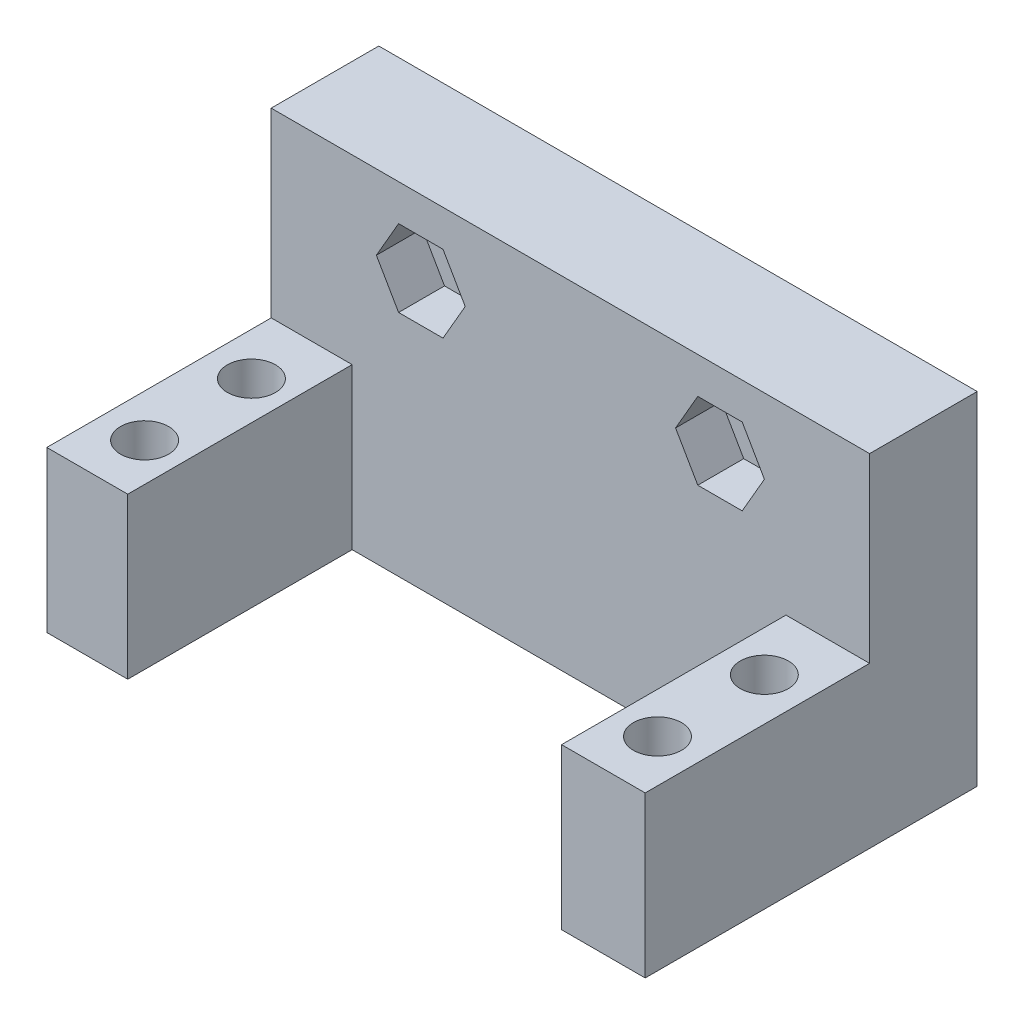
ISO-10303-21;
HEADER;
FILE_DESCRIPTION(('STEP AP214'),'2;1');
FILE_NAME('part.step','',(''),(''),'','','');
FILE_SCHEMA(('AUTOMOTIVE_DESIGN { 1 0 10303 214 1 1 1 1 }'));
ENDSEC;
DATA;
#1=APPLICATION_CONTEXT('core data for automotive mechanical design processes');
#2=APPLICATION_PROTOCOL_DEFINITION('international standard','automotive_design',2000,#1);
#3=PRODUCT_CONTEXT('',#1,'mechanical');
#4=PRODUCT('Part','Part','',(#3));
#5=PRODUCT_RELATED_PRODUCT_CATEGORY('part','',(#4));
#6=PRODUCT_DEFINITION_FORMATION('','',#4);
#7=PRODUCT_DEFINITION_CONTEXT('part definition',#1,'design');
#8=PRODUCT_DEFINITION('design','',#6,#7);
#9=PRODUCT_DEFINITION_SHAPE('','',#8);
#10=(LENGTH_UNIT() NAMED_UNIT(*) SI_UNIT(.MILLI.,.METRE.));
#11=(NAMED_UNIT(*) PLANE_ANGLE_UNIT() SI_UNIT($,.RADIAN.));
#12=(NAMED_UNIT(*) SI_UNIT($,.STERADIAN.) SOLID_ANGLE_UNIT());
#13=UNCERTAINTY_MEASURE_WITH_UNIT(LENGTH_MEASURE(1.E-05),#10,'distance_accuracy_value','');
#14=(GEOMETRIC_REPRESENTATION_CONTEXT(3) GLOBAL_UNCERTAINTY_ASSIGNED_CONTEXT((#13)) GLOBAL_UNIT_ASSIGNED_CONTEXT((#10,
#11,#12)) REPRESENTATION_CONTEXT('',''));
#15=CARTESIAN_POINT('',(0.,0.,0.));
#16=DIRECTION('',(0.,0.,1.));
#17=DIRECTION('',(1.,0.,0.));
#18=AXIS2_PLACEMENT_3D('',#15,#16,#17);
#19=CARTESIAN_POINT('',(0.,-14.,10.07));
#20=DIRECTION('',(0.,0.,1.));
#21=DIRECTION('',(1.,0.,0.));
#22=AXIS2_PLACEMENT_3D('',#19,#20,#21);
#23=PLANE('',#22);
#24=DIRECTION('',(-0.500000000000005,0.866025403784436,0.));
#25=VECTOR('',#24,1.);
#26=CARTESIAN_POINT('',(-1.32013071988487,-14.762177826491,10.07));
#27=LINE('',#26,#25);
#28=CARTESIAN_POINT('',(-9.84307806183471,0.,10.07));
#29=VERTEX_POINT('',#28);
#30=CARTESIAN_POINT('',(-11.9215390309174,3.6,10.07));
#31=VERTEX_POINT('',#30);
#32=EDGE_CURVE('E11',#29,#31,#27,.T.);
#33=ORIENTED_EDGE('',*,*,#32,.F.);
#34=DIRECTION('',(0.499999999999996,0.866025403784441,0.));
#35=VECTOR('',#34,1.);
#36=CARTESIAN_POINT('',(-13.4444863728671,-6.23782217350901,10.07));
#37=LINE('',#36,#35);
#38=CARTESIAN_POINT('',(-11.9215390309173,-3.59999999999998,10.07));
#39=VERTEX_POINT('',#38);
#40=EDGE_CURVE('E48',#39,#29,#37,.T.);
#41=ORIENTED_EDGE('',*,*,#40,.F.);
#42=DIRECTION('',(1.,0.,0.));
#43=VECTOR('',#42,1.);
#44=CARTESIAN_POINT('',(0.,-3.59999999999992,10.07));
#45=LINE('',#44,#43);
#46=CARTESIAN_POINT('',(-16.0784609690826,-3.60000000000001,10.07));
#47=VERTEX_POINT('',#46);
#48=EDGE_CURVE('E395',#47,#39,#45,.T.);
#49=ORIENTED_EDGE('',*,*,#48,.F.);
#50=DIRECTION('',(0.500000000000005,-0.866025403784436,0.));
#51=VECTOR('',#50,1.);
#52=CARTESIAN_POINT('',(-7.55551362713279,-18.3621778264911,10.07));
#53=LINE('',#52,#51);
#54=CARTESIAN_POINT('',(-18.1569219381653,0.,10.07));
#55=VERTEX_POINT('',#54);
#56=EDGE_CURVE('E393',#55,#47,#53,.T.);
#57=ORIENTED_EDGE('',*,*,#56,.F.);
#58=DIRECTION('',(-0.5,-0.866025403784439,0.));
#59=VECTOR('',#58,1.);
#60=CARTESIAN_POINT('',(-19.679869280115,-2.63782217350893,10.07));
#61=LINE('',#60,#59);
#62=CARTESIAN_POINT('',(-16.0784609690827,3.6,10.07));
#63=VERTEX_POINT('',#62);
#64=EDGE_CURVE('E391',#63,#55,#61,.T.);
#65=ORIENTED_EDGE('',*,*,#64,.F.);
#66=DIRECTION('',(-1.,0.,0.));
#67=VECTOR('',#66,1.);
#68=CARTESIAN_POINT('',(0.,3.6,10.07));
#69=LINE('',#68,#67);
#70=EDGE_CURVE('E389',#31,#63,#69,.T.);
#71=ORIENTED_EDGE('',*,*,#70,.F.);
#72=EDGE_LOOP('',(#33,#41,#49,#57,#65,#71));
#73=FACE_BOUND('',#72,.T.);
#74=DIRECTION('',(-0.500000000000004,0.866025403784436,0.));
#75=VECTOR('',#74,1.);
#76=CARTESIAN_POINT('',(19.679869280115,-2.63782217350883,10.07));
#77=LINE('',#76,#75);
#78=CARTESIAN_POINT('',(18.1569219381653,0.,10.07));
#79=VERTEX_POINT('',#78);
#80=CARTESIAN_POINT('',(16.0784609690826,3.59999999999999,10.07));
#81=VERTEX_POINT('',#80);
#82=EDGE_CURVE('E386',#79,#81,#77,.T.);
#83=ORIENTED_EDGE('',*,*,#82,.F.);
#84=DIRECTION('',(0.499999999999995,0.866025403784441,0.));
#85=VECTOR('',#84,1.);
#86=CARTESIAN_POINT('',(7.55551362713301,-18.3621778264911,10.07));
#87=LINE('',#86,#85);
#88=CARTESIAN_POINT('',(16.0784609690827,-3.59999999999998,10.07));
#89=VERTEX_POINT('',#88);
#90=EDGE_CURVE('E384',#89,#79,#87,.T.);
#91=ORIENTED_EDGE('',*,*,#90,.F.);
#92=DIRECTION('',(1.,0.,0.));
#93=VECTOR('',#92,1.);
#94=CARTESIAN_POINT('',(0.,-3.60000000000005,10.07));
#95=LINE('',#94,#93);
#96=CARTESIAN_POINT('',(11.9215390309174,-3.6,10.07));
#97=VERTEX_POINT('',#96);
#98=EDGE_CURVE('E382',#97,#89,#95,.T.);
#99=ORIENTED_EDGE('',*,*,#98,.F.);
#100=DIRECTION('',(0.500000000000004,-0.866025403784436,0.));
#101=VECTOR('',#100,1.);
#102=CARTESIAN_POINT('',(13.4444863728671,-6.23782217350885,10.07));
#103=LINE('',#102,#101);
#104=CARTESIAN_POINT('',(9.84307806183472,0.,10.07));
#105=VERTEX_POINT('',#104);
#106=EDGE_CURVE('E380',#105,#97,#103,.T.);
#107=ORIENTED_EDGE('',*,*,#106,.F.);
#108=DIRECTION('',(-0.499999999999996,-0.866025403784441,0.));
#109=VECTOR('',#108,1.);
#110=CARTESIAN_POINT('',(1.32013071988505,-14.7621778264911,10.07));
#111=LINE('',#110,#109);
#112=CARTESIAN_POINT('',(11.9215390309173,3.59999999999997,10.07));
#113=VERTEX_POINT('',#112);
#114=EDGE_CURVE('E378',#113,#105,#111,.T.);
#115=ORIENTED_EDGE('',*,*,#114,.F.);
#116=DIRECTION('',(-1.,0.,0.));
#117=VECTOR('',#116,1.);
#118=CARTESIAN_POINT('',(0.,3.59999999999992,10.07));
#119=LINE('',#118,#117);
#120=EDGE_CURVE('E376',#81,#113,#119,.T.);
#121=ORIENTED_EDGE('',*,*,#120,.F.);
#122=EDGE_LOOP('',(#83,#91,#99,#107,#115,#121));
#123=FACE_BOUND('',#122,.T.);
#124=DIRECTION('',(0.,-1.,0.));
#125=VECTOR('',#124,1.);
#126=CARTESIAN_POINT('',(20.1750886473847,-9.99999999999999,10.07));
#127=LINE('',#126,#125);
#128=CARTESIAN_POINT('',(20.1750886473847,-9.99999999999999,10.07));
#129=VERTEX_POINT('',#128);
#130=CARTESIAN_POINT('',(20.1750886473847,-25.,10.07));
#131=VERTEX_POINT('',#130);
#132=EDGE_CURVE('E212',#129,#131,#127,.T.);
#133=ORIENTED_EDGE('',*,*,#132,.F.);
#134=DIRECTION('',(-1.,0.,0.));
#135=VECTOR('',#134,1.);
#136=CARTESIAN_POINT('',(28.,-10.,10.07));
#137=LINE('',#136,#135);
#138=CARTESIAN_POINT('',(28.,-10.,10.07));
#139=VERTEX_POINT('',#138);
#140=EDGE_CURVE('E209',#139,#129,#137,.T.);
#141=ORIENTED_EDGE('',*,*,#140,.F.);
#142=DIRECTION('',(0.,1.,0.));
#143=VECTOR('',#142,1.);
#144=CARTESIAN_POINT('',(28.,-10.,10.07));
#145=LINE('',#144,#143);
#146=CARTESIAN_POINT('',(28.,7.,10.07));
#147=VERTEX_POINT('',#146);
#148=EDGE_CURVE('E236',#139,#147,#145,.T.);
#149=ORIENTED_EDGE('',*,*,#148,.T.);
#150=DIRECTION('',(1.,0.,0.));
#151=VECTOR('',#150,1.);
#152=CARTESIAN_POINT('',(0.,7.,10.07));
#153=LINE('',#152,#151);
#154=CARTESIAN_POINT('',(-28.,7.,10.07));
#155=VERTEX_POINT('',#154);
#156=EDGE_CURVE('E358',#155,#147,#153,.T.);
#157=ORIENTED_EDGE('',*,*,#156,.F.);
#158=DIRECTION('',(0.,1.,0.));
#159=VECTOR('',#158,1.);
#160=CARTESIAN_POINT('',(-28.,-10.,10.07));
#161=LINE('',#160,#159);
#162=CARTESIAN_POINT('',(-28.,-10.,10.07));
#163=VERTEX_POINT('',#162);
#164=EDGE_CURVE('E237',#163,#155,#161,.T.);
#165=ORIENTED_EDGE('',*,*,#164,.F.);
#166=CARTESIAN_POINT('',(-20.4249113526153,-10.,10.07));
#167=VERTEX_POINT('',#166);
#168=EDGE_CURVE('E56',#167,#163,#137,.T.);
#169=ORIENTED_EDGE('',*,*,#168,.F.);
#170=DIRECTION('',(0.,1.,0.));
#171=VECTOR('',#170,1.);
#172=CARTESIAN_POINT('',(-20.4249113526153,-25.,10.07));
#173=LINE('',#172,#171);
#174=CARTESIAN_POINT('',(-20.4249113526153,-25.,10.07));
#175=VERTEX_POINT('',#174);
#176=EDGE_CURVE('E227',#175,#167,#173,.T.);
#177=ORIENTED_EDGE('',*,*,#176,.F.);
#178=DIRECTION('',(-1.,0.,0.));
#179=VECTOR('',#178,1.);
#180=CARTESIAN_POINT('',(0.,-25.,10.07));
#181=LINE('',#180,#179);
#182=EDGE_CURVE('E64',#131,#175,#181,.T.);
#183=ORIENTED_EDGE('',*,*,#182,.F.);
#184=EDGE_LOOP('',(#133,#141,#149,#157,#165,#169,#177,#183));
#185=FACE_BOUND('',#184,.T.);
#186=ADVANCED_FACE('F39',(#73,#123,#185),#23,.T.);
#187=CARTESIAN_POINT('',(0.,0.,31.07));
#188=DIRECTION('',(0.,0.,1.));
#189=DIRECTION('',(1.,0.,0.));
#190=AXIS2_PLACEMENT_3D('',#187,#188,#189);
#191=PLANE('',#190);
#192=DIRECTION('',(-1.,0.,0.));
#193=VECTOR('',#192,1.);
#194=CARTESIAN_POINT('',(0.,-25.,31.07));
#195=LINE('',#194,#193);
#196=CARTESIAN_POINT('',(-20.4249113526153,-25.,31.07));
#197=VERTEX_POINT('',#196);
#198=CARTESIAN_POINT('',(-28.,-25.,31.07));
#199=VERTEX_POINT('',#198);
#200=EDGE_CURVE('E338',#197,#199,#195,.T.);
#201=ORIENTED_EDGE('',*,*,#200,.F.);
#202=DIRECTION('',(0.,-1.,0.));
#203=VECTOR('',#202,1.);
#204=CARTESIAN_POINT('',(-20.4249113526153,-25.,31.07));
#205=LINE('',#204,#203);
#206=CARTESIAN_POINT('',(-20.4249113526153,-10.,31.07));
#207=VERTEX_POINT('',#206);
#208=EDGE_CURVE('E221',#207,#197,#205,.T.);
#209=ORIENTED_EDGE('',*,*,#208,.F.);
#210=DIRECTION('',(1.,0.,0.));
#211=VECTOR('',#210,1.);
#212=CARTESIAN_POINT('',(28.,-10.,31.07));
#213=LINE('',#212,#211);
#214=CARTESIAN_POINT('',(-28.,-10.,31.07));
#215=VERTEX_POINT('',#214);
#216=EDGE_CURVE('E202',#215,#207,#213,.T.);
#217=ORIENTED_EDGE('',*,*,#216,.F.);
#218=DIRECTION('',(0.,-1.,0.));
#219=VECTOR('',#218,1.);
#220=CARTESIAN_POINT('',(-28.,-7.,31.07));
#221=LINE('',#220,#219);
#222=EDGE_CURVE('E364',#215,#199,#221,.T.);
#223=ORIENTED_EDGE('',*,*,#222,.T.);
#224=EDGE_LOOP('',(#201,#209,#217,#223));
#225=FACE_BOUND('',#224,.T.);
#226=ADVANCED_FACE('F434',(#225),#191,.T.);
#227=DIRECTION('',(0.,1.,0.));
#228=VECTOR('',#227,1.);
#229=CARTESIAN_POINT('',(28.,-7.,31.07));
#230=LINE('',#229,#228);
#231=CARTESIAN_POINT('',(28.,-25.,31.07));
#232=VERTEX_POINT('',#231);
#233=CARTESIAN_POINT('',(28.,-10.,31.07));
#234=VERTEX_POINT('',#233);
#235=EDGE_CURVE('E198',#232,#234,#230,.T.);
#236=ORIENTED_EDGE('',*,*,#235,.T.);
#237=CARTESIAN_POINT('',(20.1750886473847,-9.99999999999999,31.07));
#238=VERTEX_POINT('',#237);
#239=EDGE_CURVE('E192',#238,#234,#213,.T.);
#240=ORIENTED_EDGE('',*,*,#239,.F.);
#241=DIRECTION('',(0.,1.,0.));
#242=VECTOR('',#241,1.);
#243=CARTESIAN_POINT('',(20.1750886473847,-9.99999999999999,31.07));
#244=LINE('',#243,#242);
#245=CARTESIAN_POINT('',(20.1750886473847,-25.,31.07));
#246=VERTEX_POINT('',#245);
#247=EDGE_CURVE('E197',#246,#238,#244,.T.);
#248=ORIENTED_EDGE('',*,*,#247,.F.);
#249=DIRECTION('',(-1.,0.,0.));
#250=VECTOR('',#249,1.);
#251=CARTESIAN_POINT('',(0.,-25.,31.07));
#252=LINE('',#251,#250);
#253=EDGE_CURVE('E350',#232,#246,#252,.T.);
#254=ORIENTED_EDGE('',*,*,#253,.F.);
#255=EDGE_LOOP('',(#236,#240,#248,#254));
#256=FACE_BOUND('',#255,.T.);
#257=ADVANCED_FACE('F194',(#256),#191,.T.);
#258=CARTESIAN_POINT('',(24.0000000000001,-13.3639610306789,25.92));
#259=DIRECTION('',(0.,1.,0.));
#260=DIRECTION('',(-1.,0.,0.));
#261=AXIS2_PLACEMENT_3D('',#258,#259,#260);
#262=CYLINDRICAL_SURFACE('',#261,2.25);
#263=CARTESIAN_POINT('',(24.0000000000001,-25.,25.92));
#264=DIRECTION('',(0.,-1.,0.));
#265=DIRECTION('',(1.,0.,0.));
#266=AXIS2_PLACEMENT_3D('',#263,#264,#265);
#267=CIRCLE('',#266,2.25);
#268=CARTESIAN_POINT('',(26.2500000000001,-25.,25.92));
#269=VERTEX_POINT('',#268);
#270=EDGE_CURVE('E334',#269,#269,#267,.F.);
#271=ORIENTED_EDGE('',*,*,#270,.F.);
#272=EDGE_LOOP('',(#271));
#273=FACE_BOUND('',#272,.T.);
#274=CARTESIAN_POINT('',(24.0000000000001,-10.,25.92));
#275=DIRECTION('',(0.,1.,0.));
#276=DIRECTION('',(-1.,0.,0.));
#277=AXIS2_PLACEMENT_3D('',#274,#275,#276);
#278=CIRCLE('',#277,2.25);
#279=CARTESIAN_POINT('',(21.7500000000001,-10.,25.92));
#280=VERTEX_POINT('',#279);
#281=EDGE_CURVE('E251',#280,#280,#278,.F.);
#282=ORIENTED_EDGE('',*,*,#281,.F.);
#283=EDGE_LOOP('',(#282));
#284=FACE_BOUND('',#283,.T.);
#285=ADVANCED_FACE('F528',(#273,#284),#262,.F.);
#286=CARTESIAN_POINT('',(-24.,-13.3639610306789,15.92));
#287=DIRECTION('',(0.,1.,0.));
#288=DIRECTION('',(-1.,0.,0.));
#289=AXIS2_PLACEMENT_3D('',#286,#287,#288);
#290=CYLINDRICAL_SURFACE('',#289,2.25);
#291=CARTESIAN_POINT('',(-24.,-25.,15.92));
#292=DIRECTION('',(0.,-1.,0.));
#293=DIRECTION('',(1.,0.,0.));
#294=AXIS2_PLACEMENT_3D('',#291,#292,#293);
#295=CIRCLE('',#294,2.25);
#296=CARTESIAN_POINT('',(-21.75,-25.,15.92));
#297=VERTEX_POINT('',#296);
#298=EDGE_CURVE('E352',#297,#297,#295,.F.);
#299=ORIENTED_EDGE('',*,*,#298,.F.);
#300=EDGE_LOOP('',(#299));
#301=FACE_BOUND('',#300,.T.);
#302=CARTESIAN_POINT('',(-24.,-10.,15.92));
#303=DIRECTION('',(0.,1.,0.));
#304=DIRECTION('',(-1.,0.,0.));
#305=AXIS2_PLACEMENT_3D('',#302,#303,#304);
#306=CIRCLE('',#305,2.25);
#307=CARTESIAN_POINT('',(-26.25,-10.,15.92));
#308=VERTEX_POINT('',#307);
#309=EDGE_CURVE('E248',#308,#308,#306,.F.);
#310=ORIENTED_EDGE('',*,*,#309,.F.);
#311=EDGE_LOOP('',(#310));
#312=FACE_BOUND('',#311,.T.);
#313=ADVANCED_FACE('F524',(#301,#312),#290,.F.);
#314=CARTESIAN_POINT('',(-23.9999999999999,-13.3639610306789,25.92));
#315=DIRECTION('',(0.,1.,0.));
#316=DIRECTION('',(-1.,0.,0.));
#317=AXIS2_PLACEMENT_3D('',#314,#315,#316);
#318=CYLINDRICAL_SURFACE('',#317,2.25);
#319=CARTESIAN_POINT('',(-23.9999999999999,-25.,25.92));
#320=DIRECTION('',(0.,-1.,0.));
#321=DIRECTION('',(1.,0.,0.));
#322=AXIS2_PLACEMENT_3D('',#319,#320,#321);
#323=CIRCLE('',#322,2.25);
#324=CARTESIAN_POINT('',(-21.7499999999999,-25.,25.92));
#325=VERTEX_POINT('',#324);
#326=EDGE_CURVE('E285',#325,#325,#323,.F.);
#327=ORIENTED_EDGE('',*,*,#326,.F.);
#328=EDGE_LOOP('',(#327));
#329=FACE_BOUND('',#328,.T.);
#330=CARTESIAN_POINT('',(-23.9999999999999,-10.,25.92));
#331=DIRECTION('',(0.,1.,0.));
#332=DIRECTION('',(-1.,0.,0.));
#333=AXIS2_PLACEMENT_3D('',#330,#331,#332);
#334=CIRCLE('',#333,2.25);
#335=CARTESIAN_POINT('',(-26.2499999999999,-10.,25.92));
#336=VERTEX_POINT('',#335);
#337=EDGE_CURVE('E245',#336,#336,#334,.F.);
#338=ORIENTED_EDGE('',*,*,#337,.F.);
#339=EDGE_LOOP('',(#338));
#340=FACE_BOUND('',#339,.T.);
#341=ADVANCED_FACE('F527',(#329,#340),#318,.F.);
#342=CARTESIAN_POINT('',(24.,-13.3639610306789,15.92));
#343=DIRECTION('',(0.,1.,0.));
#344=DIRECTION('',(-1.,0.,0.));
#345=AXIS2_PLACEMENT_3D('',#342,#343,#344);
#346=CYLINDRICAL_SURFACE('',#345,2.25);
#347=CARTESIAN_POINT('',(24.,-25.,15.92));
#348=DIRECTION('',(0.,-1.,0.));
#349=DIRECTION('',(1.,0.,0.));
#350=AXIS2_PLACEMENT_3D('',#347,#348,#349);
#351=CIRCLE('',#350,2.25);
#352=CARTESIAN_POINT('',(26.25,-25.,15.92));
#353=VERTEX_POINT('',#352);
#354=EDGE_CURVE('E355',#353,#353,#351,.F.);
#355=ORIENTED_EDGE('',*,*,#354,.F.);
#356=EDGE_LOOP('',(#355));
#357=FACE_BOUND('',#356,.T.);
#358=CARTESIAN_POINT('',(24.,-10.,15.92));
#359=DIRECTION('',(0.,1.,0.));
#360=DIRECTION('',(-1.,0.,0.));
#361=AXIS2_PLACEMENT_3D('',#358,#359,#360);
#362=CIRCLE('',#361,2.25);
#363=CARTESIAN_POINT('',(21.75,-10.,15.92));
#364=VERTEX_POINT('',#363);
#365=EDGE_CURVE('E240',#364,#364,#362,.F.);
#366=ORIENTED_EDGE('',*,*,#365,.F.);
#367=EDGE_LOOP('',(#366));
#368=FACE_BOUND('',#367,.T.);
#369=ADVANCED_FACE('F530',(#357,#368),#346,.F.);
#370=CARTESIAN_POINT('',(0.,7.,10.77));
#371=DIRECTION('',(0.,-1.,0.));
#372=DIRECTION('',(1.,0.,0.));
#373=AXIS2_PLACEMENT_3D('',#370,#371,#372);
#374=PLANE('',#373);
#375=DIRECTION('',(0.,0.,-1.));
#376=VECTOR('',#375,1.);
#377=CARTESIAN_POINT('',(-28.,7.,31.07));
#378=LINE('',#377,#376);
#379=CARTESIAN_POINT('',(-28.,7.,0.));
#380=VERTEX_POINT('',#379);
#381=EDGE_CURVE('E369',#155,#380,#378,.T.);
#382=ORIENTED_EDGE('',*,*,#381,.F.);
#383=ORIENTED_EDGE('',*,*,#156,.T.);
#384=DIRECTION('',(0.,0.,-1.));
#385=VECTOR('',#384,1.);
#386=CARTESIAN_POINT('',(28.,7.,31.07));
#387=LINE('',#386,#385);
#388=CARTESIAN_POINT('',(28.,7.,0.));
#389=VERTEX_POINT('',#388);
#390=EDGE_CURVE('E371',#147,#389,#387,.T.);
#391=ORIENTED_EDGE('',*,*,#390,.T.);
#392=DIRECTION('',(-1.,0.,0.));
#393=VECTOR('',#392,1.);
#394=CARTESIAN_POINT('',(0.,7.,0.));
#395=LINE('',#394,#393);
#396=EDGE_CURVE('E373',#389,#380,#395,.T.);
#397=ORIENTED_EDGE('',*,*,#396,.T.);
#398=EDGE_LOOP('',(#382,#383,#391,#397));
#399=FACE_BOUND('',#398,.T.);
#400=ADVANCED_FACE('F41',(#399),#374,.F.);
#401=CARTESIAN_POINT('',(0.,0.,0.));
#402=DIRECTION('',(0.,0.,1.));
#403=DIRECTION('',(1.,0.,0.));
#404=AXIS2_PLACEMENT_3D('',#401,#402,#403);
#405=PLANE('',#404);
#406=CARTESIAN_POINT('',(14.,0.,0.));
#407=DIRECTION('',(0.,0.,1.));
#408=DIRECTION('',(1.,0.,0.));
#409=AXIS2_PLACEMENT_3D('',#406,#407,#408);
#410=CIRCLE('',#409,2.2);
#411=CARTESIAN_POINT('',(16.2,0.,0.));
#412=VERTEX_POINT('',#411);
#413=EDGE_CURVE('E258',#412,#412,#410,.T.);
#414=ORIENTED_EDGE('',*,*,#413,.T.);
#415=EDGE_LOOP('',(#414));
#416=FACE_BOUND('',#415,.T.);
#417=CARTESIAN_POINT('',(-14.,0.,0.));
#418=DIRECTION('',(0.,0.,1.));
#419=DIRECTION('',(1.,0.,0.));
#420=AXIS2_PLACEMENT_3D('',#417,#418,#419);
#421=CIRCLE('',#420,2.2);
#422=CARTESIAN_POINT('',(-11.8,0.,0.));
#423=VERTEX_POINT('',#422);
#424=EDGE_CURVE('E255',#423,#423,#421,.T.);
#425=ORIENTED_EDGE('',*,*,#424,.T.);
#426=EDGE_LOOP('',(#425));
#427=FACE_BOUND('',#426,.T.);
#428=DIRECTION('',(0.,1.,0.));
#429=VECTOR('',#428,1.);
#430=CARTESIAN_POINT('',(28.,-64.0262474655312,0.));
#431=LINE('',#430,#429);
#432=CARTESIAN_POINT('',(28.,-25.,0.));
#433=VERTEX_POINT('',#432);
#434=EDGE_CURVE('E360',#433,#389,#431,.T.);
#435=ORIENTED_EDGE('',*,*,#434,.F.);
#436=DIRECTION('',(1.,0.,0.));
#437=VECTOR('',#436,1.);
#438=CARTESIAN_POINT('',(0.,-25.,0.));
#439=LINE('',#438,#437);
#440=CARTESIAN_POINT('',(-28.,-25.,0.));
#441=VERTEX_POINT('',#440);
#442=EDGE_CURVE('E344',#441,#433,#439,.T.);
#443=ORIENTED_EDGE('',*,*,#442,.F.);
#444=DIRECTION('',(0.,1.,0.));
#445=VECTOR('',#444,1.);
#446=CARTESIAN_POINT('',(-28.,-64.0262474655312,0.));
#447=LINE('',#446,#445);
#448=EDGE_CURVE('E361',#441,#380,#447,.T.);
#449=ORIENTED_EDGE('',*,*,#448,.T.);
#450=ORIENTED_EDGE('',*,*,#396,.F.);
#451=EDGE_LOOP('',(#435,#443,#449,#450));
#452=FACE_BOUND('',#451,.T.);
#453=ADVANCED_FACE('F455',(#416,#427,#452),#405,.F.);
#454=CARTESIAN_POINT('',(28.,-7.,31.07));
#455=DIRECTION('',(-1.,0.,0.));
#456=DIRECTION('',(0.,0.,1.));
#457=AXIS2_PLACEMENT_3D('',#454,#455,#456);
#458=PLANE('',#457);
#459=ORIENTED_EDGE('',*,*,#390,.F.);
#460=ORIENTED_EDGE('',*,*,#148,.F.);
#461=DIRECTION('',(0.,0.,-1.));
#462=VECTOR('',#461,1.);
#463=CARTESIAN_POINT('',(28.,-10.,31.07));
#464=LINE('',#463,#462);
#465=EDGE_CURVE('E232',#234,#139,#464,.T.);
#466=ORIENTED_EDGE('',*,*,#465,.F.);
#467=ORIENTED_EDGE('',*,*,#235,.F.);
#468=DIRECTION('',(0.,0.,1.));
#469=VECTOR('',#468,1.);
#470=CARTESIAN_POINT('',(28.,-25.,0.));
#471=LINE('',#470,#469);
#472=EDGE_CURVE('E347',#433,#232,#471,.T.);
#473=ORIENTED_EDGE('',*,*,#472,.F.);
#474=ORIENTED_EDGE('',*,*,#434,.T.);
#475=EDGE_LOOP('',(#459,#460,#466,#467,#473,#474));
#476=FACE_BOUND('',#475,.T.);
#477=ADVANCED_FACE('F445',(#476),#458,.F.);
#478=CARTESIAN_POINT('',(-28.,-7.,31.07));
#479=DIRECTION('',(1.,0.,0.));
#480=DIRECTION('',(0.,0.,-1.));
#481=AXIS2_PLACEMENT_3D('',#478,#479,#480);
#482=PLANE('',#481);
#483=DIRECTION('',(0.,0.,1.));
#484=VECTOR('',#483,1.);
#485=CARTESIAN_POINT('',(-28.,-10.,31.07));
#486=LINE('',#485,#484);
#487=EDGE_CURVE('E203',#163,#215,#486,.T.);
#488=ORIENTED_EDGE('',*,*,#487,.F.);
#489=ORIENTED_EDGE('',*,*,#164,.T.);
#490=ORIENTED_EDGE('',*,*,#381,.T.);
#491=ORIENTED_EDGE('',*,*,#448,.F.);
#492=DIRECTION('',(0.,0.,-1.));
#493=VECTOR('',#492,1.);
#494=CARTESIAN_POINT('',(-28.,-25.,0.));
#495=LINE('',#494,#493);
#496=EDGE_CURVE('E341',#199,#441,#495,.T.);
#497=ORIENTED_EDGE('',*,*,#496,.F.);
#498=ORIENTED_EDGE('',*,*,#222,.F.);
#499=EDGE_LOOP('',(#488,#489,#490,#491,#497,#498));
#500=FACE_BOUND('',#499,.T.);
#501=ADVANCED_FACE('F451',(#500),#482,.F.);
#502=CARTESIAN_POINT('',(0.,-25.,0.));
#503=DIRECTION('',(0.,-1.,0.));
#504=DIRECTION('',(1.,0.,0.));
#505=AXIS2_PLACEMENT_3D('',#502,#503,#504);
#506=PLANE('',#505);
#507=DIRECTION('',(0.,0.,1.));
#508=VECTOR('',#507,1.);
#509=CARTESIAN_POINT('',(20.1750886473847,-25.,31.07));
#510=LINE('',#509,#508);
#511=EDGE_CURVE('E216',#131,#246,#510,.T.);
#512=ORIENTED_EDGE('',*,*,#511,.F.);
#513=ORIENTED_EDGE('',*,*,#182,.T.);
#514=DIRECTION('',(0.,0.,-1.));
#515=VECTOR('',#514,1.);
#516=CARTESIAN_POINT('',(-20.4249113526153,-25.,31.07));
#517=LINE('',#516,#515);
#518=EDGE_CURVE('E224',#197,#175,#517,.T.);
#519=ORIENTED_EDGE('',*,*,#518,.F.);
#520=ORIENTED_EDGE('',*,*,#200,.T.);
#521=ORIENTED_EDGE('',*,*,#496,.T.);
#522=ORIENTED_EDGE('',*,*,#442,.T.);
#523=ORIENTED_EDGE('',*,*,#472,.T.);
#524=ORIENTED_EDGE('',*,*,#253,.T.);
#525=EDGE_LOOP('',(#512,#513,#519,#520,#521,#522,#523,#524));
#526=FACE_BOUND('',#525,.T.);
#527=ORIENTED_EDGE('',*,*,#326,.T.);
#528=EDGE_LOOP('',(#527));
#529=FACE_BOUND('',#528,.T.);
#530=ORIENTED_EDGE('',*,*,#270,.T.);
#531=EDGE_LOOP('',(#530));
#532=FACE_BOUND('',#531,.T.);
#533=ORIENTED_EDGE('',*,*,#298,.T.);
#534=EDGE_LOOP('',(#533));
#535=FACE_BOUND('',#534,.T.);
#536=ORIENTED_EDGE('',*,*,#354,.T.);
#537=EDGE_LOOP('',(#536));
#538=FACE_BOUND('',#537,.T.);
#539=ADVANCED_FACE('F439',(#526,#529,#532,#535,#538),#506,.T.);
#540=CARTESIAN_POINT('',(13.6176914536239,7.86217782649111,5.77));
#541=DIRECTION('',(0.866025403784436,0.500000000000004,0.));
#542=DIRECTION('',(-0.500000000000004,0.866025403784436,0.));
#543=AXIS2_PLACEMENT_3D('',#540,#541,#542);
#544=PLANE('',#543);
#545=ORIENTED_EDGE('',*,*,#82,.T.);
#546=DIRECTION('',(0.,0.,1.));
#547=VECTOR('',#546,1.);
#548=CARTESIAN_POINT('',(16.0784609690826,3.59999999999999,5.77));
#549=LINE('',#548,#547);
#550=CARTESIAN_POINT('',(16.0784609690826,3.59999999999999,5.77));
#551=VERTEX_POINT('',#550);
#552=EDGE_CURVE('E316',#551,#81,#549,.T.);
#553=ORIENTED_EDGE('',*,*,#552,.F.);
#554=DIRECTION('',(-0.500000000000004,0.866025403784436,0.));
#555=VECTOR('',#554,1.);
#556=CARTESIAN_POINT('',(13.6176914536239,7.86217782649111,5.77));
#557=LINE('',#556,#555);
#558=CARTESIAN_POINT('',(18.1569219381653,0.,5.77));
#559=VERTEX_POINT('',#558);
#560=EDGE_CURVE('E261',#559,#551,#557,.T.);
#561=ORIENTED_EDGE('',*,*,#560,.F.);
#562=DIRECTION('',(0.,0.,1.));
#563=VECTOR('',#562,1.);
#564=CARTESIAN_POINT('',(18.1569219381653,0.,5.77));
#565=LINE('',#564,#563);
#566=EDGE_CURVE('E266',#559,#79,#565,.T.);
#567=ORIENTED_EDGE('',*,*,#566,.T.);
#568=EDGE_LOOP('',(#545,#553,#561,#567));
#569=FACE_BOUND('',#568,.T.);
#570=ADVANCED_FACE('F503',(#569),#544,.F.);
#571=CARTESIAN_POINT('',(13.617691453624,-7.862177826491,5.77));
#572=DIRECTION('',(0.866025403784441,-0.499999999999995,0.));
#573=DIRECTION('',(0.499999999999995,0.866025403784441,0.));
#574=AXIS2_PLACEMENT_3D('',#571,#572,#573);
#575=PLANE('',#574);
#576=ORIENTED_EDGE('',*,*,#90,.T.);
#577=ORIENTED_EDGE('',*,*,#566,.F.);
#578=DIRECTION('',(0.499999999999995,0.866025403784441,0.));
#579=VECTOR('',#578,1.);
#580=CARTESIAN_POINT('',(13.617691453624,-7.862177826491,5.77));
#581=LINE('',#580,#579);
#582=CARTESIAN_POINT('',(16.0784609690827,-3.59999999999998,5.77));
#583=VERTEX_POINT('',#582);
#584=EDGE_CURVE('E313',#583,#559,#581,.T.);
#585=ORIENTED_EDGE('',*,*,#584,.F.);
#586=DIRECTION('',(0.,0.,1.));
#587=VECTOR('',#586,1.);
#588=CARTESIAN_POINT('',(16.0784609690827,-3.59999999999998,5.77));
#589=LINE('',#588,#587);
#590=EDGE_CURVE('E319',#583,#89,#589,.T.);
#591=ORIENTED_EDGE('',*,*,#590,.T.);
#592=EDGE_LOOP('',(#576,#577,#585,#591));
#593=FACE_BOUND('',#592,.T.);
#594=ADVANCED_FACE('F499',(#593),#575,.F.);
#595=CARTESIAN_POINT('',(0.,-3.60000000000005,5.77));
#596=DIRECTION('',(0.,-1.,0.));
#597=DIRECTION('',(1.,0.,0.));
#598=AXIS2_PLACEMENT_3D('',#595,#596,#597);
#599=PLANE('',#598);
#600=ORIENTED_EDGE('',*,*,#98,.T.);
#601=ORIENTED_EDGE('',*,*,#590,.F.);
#602=DIRECTION('',(1.,0.,0.));
#603=VECTOR('',#602,1.);
#604=CARTESIAN_POINT('',(0.,-3.60000000000005,5.77));
#605=LINE('',#604,#603);
#606=CARTESIAN_POINT('',(11.9215390309174,-3.6,5.77));
#607=VERTEX_POINT('',#606);
#608=EDGE_CURVE('E310',#607,#583,#605,.T.);
#609=ORIENTED_EDGE('',*,*,#608,.F.);
#610=DIRECTION('',(0.,0.,1.));
#611=VECTOR('',#610,1.);
#612=CARTESIAN_POINT('',(11.9215390309174,-3.6,5.77));
#613=LINE('',#612,#611);
#614=EDGE_CURVE('E322',#607,#97,#613,.T.);
#615=ORIENTED_EDGE('',*,*,#614,.T.);
#616=EDGE_LOOP('',(#600,#601,#609,#615));
#617=FACE_BOUND('',#616,.T.);
#618=ADVANCED_FACE('F502',(#617),#599,.F.);
#619=CARTESIAN_POINT('',(7.38230854637599,4.2621778264911,5.77));
#620=DIRECTION('',(-0.866025403784436,-0.500000000000004,0.));
#621=DIRECTION('',(0.500000000000004,-0.866025403784436,0.));
#622=AXIS2_PLACEMENT_3D('',#619,#620,#621);
#623=PLANE('',#622);
#624=ORIENTED_EDGE('',*,*,#106,.T.);
#625=ORIENTED_EDGE('',*,*,#614,.F.);
#626=DIRECTION('',(0.500000000000004,-0.866025403784436,0.));
#627=VECTOR('',#626,1.);
#628=CARTESIAN_POINT('',(7.38230854637599,4.2621778264911,5.77));
#629=LINE('',#628,#627);
#630=CARTESIAN_POINT('',(9.84307806183472,0.,5.77));
#631=VERTEX_POINT('',#630);
#632=EDGE_CURVE('E307',#631,#607,#629,.T.);
#633=ORIENTED_EDGE('',*,*,#632,.F.);
#634=DIRECTION('',(0.,0.,1.));
#635=VECTOR('',#634,1.);
#636=CARTESIAN_POINT('',(9.84307806183472,0.,5.77));
#637=LINE('',#636,#635);
#638=EDGE_CURVE('E325',#631,#105,#637,.T.);
#639=ORIENTED_EDGE('',*,*,#638,.T.);
#640=EDGE_LOOP('',(#624,#625,#633,#639));
#641=FACE_BOUND('',#640,.T.);
#642=ADVANCED_FACE('F507',(#641),#623,.F.);
#643=CARTESIAN_POINT('',(7.38230854637609,-4.26217782649106,5.77));
#644=DIRECTION('',(-0.866025403784441,0.499999999999996,0.));
#645=DIRECTION('',(-0.499999999999996,-0.866025403784441,0.));
#646=AXIS2_PLACEMENT_3D('',#643,#644,#645);
#647=PLANE('',#646);
#648=ORIENTED_EDGE('',*,*,#114,.T.);
#649=ORIENTED_EDGE('',*,*,#638,.F.);
#650=DIRECTION('',(-0.499999999999996,-0.866025403784441,0.));
#651=VECTOR('',#650,1.);
#652=CARTESIAN_POINT('',(7.38230854637609,-4.26217782649106,5.77));
#653=LINE('',#652,#651);
#654=CARTESIAN_POINT('',(11.9215390309173,3.59999999999997,5.77));
#655=VERTEX_POINT('',#654);
#656=EDGE_CURVE('E304',#655,#631,#653,.T.);
#657=ORIENTED_EDGE('',*,*,#656,.F.);
#658=DIRECTION('',(0.,0.,1.));
#659=VECTOR('',#658,1.);
#660=CARTESIAN_POINT('',(11.9215390309173,3.59999999999997,5.77));
#661=LINE('',#660,#659);
#662=EDGE_CURVE('E328',#655,#113,#661,.T.);
#663=ORIENTED_EDGE('',*,*,#662,.T.);
#664=EDGE_LOOP('',(#648,#649,#657,#663));
#665=FACE_BOUND('',#664,.T.);
#666=ADVANCED_FACE('F511',(#665),#647,.F.);
#667=CARTESIAN_POINT('',(0.,3.59999999999993,5.77));
#668=DIRECTION('',(0.,1.,0.));
#669=DIRECTION('',(-1.,0.,0.));
#670=AXIS2_PLACEMENT_3D('',#667,#668,#669);
#671=PLANE('',#670);
#672=ORIENTED_EDGE('',*,*,#120,.T.);
#673=ORIENTED_EDGE('',*,*,#662,.F.);
#674=DIRECTION('',(-1.,0.,0.));
#675=VECTOR('',#674,1.);
#676=CARTESIAN_POINT('',(0.,3.59999999999993,5.77));
#677=LINE('',#676,#675);
#678=EDGE_CURVE('E301',#551,#655,#677,.T.);
#679=ORIENTED_EDGE('',*,*,#678,.F.);
#680=ORIENTED_EDGE('',*,*,#552,.T.);
#681=EDGE_LOOP('',(#672,#673,#679,#680));
#682=FACE_BOUND('',#681,.T.);
#683=ADVANCED_FACE('F497',(#682),#671,.F.);
#684=CARTESIAN_POINT('',(0.,0.,5.77));
#685=DIRECTION('',(0.,0.,1.));
#686=DIRECTION('',(1.,0.,0.));
#687=AXIS2_PLACEMENT_3D('',#684,#685,#686);
#688=PLANE('',#687);
#689=CARTESIAN_POINT('',(14.,0.,5.77));
#690=DIRECTION('',(0.,0.,1.));
#691=DIRECTION('',(1.,0.,0.));
#692=AXIS2_PLACEMENT_3D('',#689,#690,#691);
#693=CIRCLE('',#692,2.2);
#694=CARTESIAN_POINT('',(16.2,0.,5.77));
#695=VERTEX_POINT('',#694);
#696=EDGE_CURVE('E43',#695,#695,#693,.T.);
#697=ORIENTED_EDGE('',*,*,#696,.F.);
#698=EDGE_LOOP('',(#697));
#699=FACE_BOUND('',#698,.T.);
#700=ORIENTED_EDGE('',*,*,#560,.T.);
#701=ORIENTED_EDGE('',*,*,#678,.T.);
#702=ORIENTED_EDGE('',*,*,#656,.T.);
#703=ORIENTED_EDGE('',*,*,#632,.T.);
#704=ORIENTED_EDGE('',*,*,#608,.T.);
#705=ORIENTED_EDGE('',*,*,#584,.T.);
#706=EDGE_LOOP('',(#700,#701,#702,#703,#704,#705));
#707=FACE_BOUND('',#706,.T.);
#708=ADVANCED_FACE('F494',(#699,#707),#688,.T.);
#709=CARTESIAN_POINT('',(-7.38230854637598,-4.2621778264911,5.77));
#710=DIRECTION('',(0.866025403784436,0.500000000000005,0.));
#711=DIRECTION('',(-0.500000000000005,0.866025403784436,0.));
#712=AXIS2_PLACEMENT_3D('',#709,#710,#711);
#713=PLANE('',#712);
#714=ORIENTED_EDGE('',*,*,#32,.T.);
#715=DIRECTION('',(0.,0.,1.));
#716=VECTOR('',#715,1.);
#717=CARTESIAN_POINT('',(-11.9215390309174,3.6,5.77));
#718=LINE('',#717,#716);
#719=CARTESIAN_POINT('',(-11.9215390309174,3.6,5.77));
#720=VERTEX_POINT('',#719);
#721=EDGE_CURVE('E281',#720,#31,#718,.T.);
#722=ORIENTED_EDGE('',*,*,#721,.F.);
#723=DIRECTION('',(-0.500000000000005,0.866025403784436,0.));
#724=VECTOR('',#723,1.);
#725=CARTESIAN_POINT('',(-7.38230854637598,-4.2621778264911,5.77));
#726=LINE('',#725,#724);
#727=CARTESIAN_POINT('',(-9.84307806183471,0.,5.77));
#728=VERTEX_POINT('',#727);
#729=EDGE_CURVE('E262',#728,#720,#726,.T.);
#730=ORIENTED_EDGE('',*,*,#729,.F.);
#731=DIRECTION('',(0.,0.,1.));
#732=VECTOR('',#731,1.);
#733=CARTESIAN_POINT('',(-9.84307806183471,0.,5.77));
#734=LINE('',#733,#732);
#735=EDGE_CURVE('E282',#728,#29,#734,.T.);
#736=ORIENTED_EDGE('',*,*,#735,.T.);
#737=EDGE_LOOP('',(#714,#722,#730,#736));
#738=FACE_BOUND('',#737,.T.);
#739=ADVANCED_FACE('F412',(#738),#713,.F.);
#740=CARTESIAN_POINT('',(-7.38230854637608,4.26217782649105,5.77));
#741=DIRECTION('',(0.866025403784441,-0.499999999999996,0.));
#742=DIRECTION('',(0.499999999999996,0.866025403784441,0.));
#743=AXIS2_PLACEMENT_3D('',#740,#741,#742);
#744=PLANE('',#743);
#745=ORIENTED_EDGE('',*,*,#40,.T.);
#746=ORIENTED_EDGE('',*,*,#735,.F.);
#747=DIRECTION('',(0.499999999999996,0.866025403784441,0.));
#748=VECTOR('',#747,1.);
#749=CARTESIAN_POINT('',(-7.38230854637608,4.26217782649105,5.77));
#750=LINE('',#749,#748);
#751=CARTESIAN_POINT('',(-11.9215390309173,-3.59999999999998,5.77));
#752=VERTEX_POINT('',#751);
#753=EDGE_CURVE('E278',#752,#728,#750,.T.);
#754=ORIENTED_EDGE('',*,*,#753,.F.);
#755=DIRECTION('',(0.,0.,1.));
#756=VECTOR('',#755,1.);
#757=CARTESIAN_POINT('',(-11.9215390309173,-3.59999999999998,5.77));
#758=LINE('',#757,#756);
#759=EDGE_CURVE('E286',#752,#39,#758,.T.);
#760=ORIENTED_EDGE('',*,*,#759,.T.);
#761=EDGE_LOOP('',(#745,#746,#754,#760));
#762=FACE_BOUND('',#761,.T.);
#763=ADVANCED_FACE('F430',(#762),#744,.F.);
#764=CARTESIAN_POINT('',(0.,-3.59999999999992,5.77));
#765=DIRECTION('',(0.,-1.,0.));
#766=DIRECTION('',(1.,0.,0.));
#767=AXIS2_PLACEMENT_3D('',#764,#765,#766);
#768=PLANE('',#767);
#769=ORIENTED_EDGE('',*,*,#48,.T.);
#770=ORIENTED_EDGE('',*,*,#759,.F.);
#771=DIRECTION('',(1.,0.,0.));
#772=VECTOR('',#771,1.);
#773=CARTESIAN_POINT('',(0.,-3.59999999999992,5.77));
#774=LINE('',#773,#772);
#775=CARTESIAN_POINT('',(-16.0784609690826,-3.60000000000001,5.77));
#776=VERTEX_POINT('',#775);
#777=EDGE_CURVE('E275',#776,#752,#774,.T.);
#778=ORIENTED_EDGE('',*,*,#777,.F.);
#779=DIRECTION('',(0.,0.,1.));
#780=VECTOR('',#779,1.);
#781=CARTESIAN_POINT('',(-16.0784609690826,-3.60000000000001,5.77));
#782=LINE('',#781,#780);
#783=EDGE_CURVE('E289',#776,#47,#782,.T.);
#784=ORIENTED_EDGE('',*,*,#783,.T.);
#785=EDGE_LOOP('',(#769,#770,#778,#784));
#786=FACE_BOUND('',#785,.T.);
#787=ADVANCED_FACE('F427',(#786),#768,.F.);
#788=CARTESIAN_POINT('',(-13.6176914536239,-7.86217782649112,5.77));
#789=DIRECTION('',(-0.866025403784436,-0.500000000000005,0.));
#790=DIRECTION('',(0.500000000000005,-0.866025403784436,0.));
#791=AXIS2_PLACEMENT_3D('',#788,#789,#790);
#792=PLANE('',#791);
#793=ORIENTED_EDGE('',*,*,#56,.T.);
#794=ORIENTED_EDGE('',*,*,#783,.F.);
#795=DIRECTION('',(0.500000000000005,-0.866025403784436,0.));
#796=VECTOR('',#795,1.);
#797=CARTESIAN_POINT('',(-13.6176914536239,-7.86217782649112,5.77));
#798=LINE('',#797,#796);
#799=CARTESIAN_POINT('',(-18.1569219381653,0.,5.77));
#800=VERTEX_POINT('',#799);
#801=EDGE_CURVE('E272',#800,#776,#798,.T.);
#802=ORIENTED_EDGE('',*,*,#801,.F.);
#803=DIRECTION('',(0.,0.,1.));
#804=VECTOR('',#803,1.);
#805=CARTESIAN_POINT('',(-18.1569219381653,0.,5.77));
#806=LINE('',#805,#804);
#807=EDGE_CURVE('E292',#800,#55,#806,.T.);
#808=ORIENTED_EDGE('',*,*,#807,.T.);
#809=EDGE_LOOP('',(#793,#794,#802,#808));
#810=FACE_BOUND('',#809,.T.);
#811=ADVANCED_FACE('F423',(#810),#792,.F.);
#812=CARTESIAN_POINT('',(-13.617691453624,7.86217782649107,5.77));
#813=DIRECTION('',(-0.866025403784439,0.5,0.));
#814=DIRECTION('',(-0.5,-0.866025403784439,0.));
#815=AXIS2_PLACEMENT_3D('',#812,#813,#814);
#816=PLANE('',#815);
#817=ORIENTED_EDGE('',*,*,#64,.T.);
#818=ORIENTED_EDGE('',*,*,#807,.F.);
#819=DIRECTION('',(-0.5,-0.866025403784439,0.));
#820=VECTOR('',#819,1.);
#821=CARTESIAN_POINT('',(-13.617691453624,7.86217782649107,5.77));
#822=LINE('',#821,#820);
#823=CARTESIAN_POINT('',(-16.0784609690827,3.6,5.77));
#824=VERTEX_POINT('',#823);
#825=EDGE_CURVE('E269',#824,#800,#822,.T.);
#826=ORIENTED_EDGE('',*,*,#825,.F.);
#827=DIRECTION('',(0.,0.,1.));
#828=VECTOR('',#827,1.);
#829=CARTESIAN_POINT('',(-16.0784609690827,3.6,5.77));
#830=LINE('',#829,#828);
#831=EDGE_CURVE('E295',#824,#63,#830,.T.);
#832=ORIENTED_EDGE('',*,*,#831,.T.);
#833=EDGE_LOOP('',(#817,#818,#826,#832));
#834=FACE_BOUND('',#833,.T.);
#835=ADVANCED_FACE('F419',(#834),#816,.F.);
#836=CARTESIAN_POINT('',(0.,3.6,5.77));
#837=DIRECTION('',(0.,1.,0.));
#838=DIRECTION('',(-1.,0.,0.));
#839=AXIS2_PLACEMENT_3D('',#836,#837,#838);
#840=PLANE('',#839);
#841=ORIENTED_EDGE('',*,*,#70,.T.);
#842=ORIENTED_EDGE('',*,*,#831,.F.);
#843=DIRECTION('',(-1.,0.,0.));
#844=VECTOR('',#843,1.);
#845=CARTESIAN_POINT('',(0.,3.6,5.77));
#846=LINE('',#845,#844);
#847=EDGE_CURVE('E265',#720,#824,#846,.T.);
#848=ORIENTED_EDGE('',*,*,#847,.F.);
#849=ORIENTED_EDGE('',*,*,#721,.T.);
#850=EDGE_LOOP('',(#841,#842,#848,#849));
#851=FACE_BOUND('',#850,.T.);
#852=ADVANCED_FACE('F406',(#851),#840,.F.);
#853=CARTESIAN_POINT('',(0.,0.,5.77));
#854=DIRECTION('',(0.,0.,1.));
#855=DIRECTION('',(1.,0.,0.));
#856=AXIS2_PLACEMENT_3D('',#853,#854,#855);
#857=PLANE('',#856);
#858=CARTESIAN_POINT('',(-14.,0.,5.77));
#859=DIRECTION('',(0.,0.,1.));
#860=DIRECTION('',(1.,0.,0.));
#861=AXIS2_PLACEMENT_3D('',#858,#859,#860);
#862=CIRCLE('',#861,2.2);
#863=CARTESIAN_POINT('',(-11.8,0.,5.77));
#864=VERTEX_POINT('',#863);
#865=EDGE_CURVE('E254',#864,#864,#862,.T.);
#866=ORIENTED_EDGE('',*,*,#865,.F.);
#867=EDGE_LOOP('',(#866));
#868=FACE_BOUND('',#867,.T.);
#869=ORIENTED_EDGE('',*,*,#729,.T.);
#870=ORIENTED_EDGE('',*,*,#847,.T.);
#871=ORIENTED_EDGE('',*,*,#825,.T.);
#872=ORIENTED_EDGE('',*,*,#801,.T.);
#873=ORIENTED_EDGE('',*,*,#777,.T.);
#874=ORIENTED_EDGE('',*,*,#753,.T.);
#875=EDGE_LOOP('',(#869,#870,#871,#872,#873,#874));
#876=FACE_BOUND('',#875,.T.);
#877=ADVANCED_FACE('F403',(#868,#876),#857,.T.);
#878=CARTESIAN_POINT('',(-14.,0.,-10.93));
#879=DIRECTION('',(0.,0.,1.));
#880=DIRECTION('',(1.,0.,0.));
#881=AXIS2_PLACEMENT_3D('',#878,#879,#880);
#882=CYLINDRICAL_SURFACE('',#881,2.2);
#883=ORIENTED_EDGE('',*,*,#865,.T.);
#884=EDGE_LOOP('',(#883));
#885=FACE_BOUND('',#884,.T.);
#886=ORIENTED_EDGE('',*,*,#424,.F.);
#887=EDGE_LOOP('',(#886));
#888=FACE_BOUND('',#887,.T.);
#889=ADVANCED_FACE('F400',(#885,#888),#882,.F.);
#890=CARTESIAN_POINT('',(14.,0.,-10.93));
#891=DIRECTION('',(0.,0.,1.));
#892=DIRECTION('',(1.,0.,0.));
#893=AXIS2_PLACEMENT_3D('',#890,#891,#892);
#894=CYLINDRICAL_SURFACE('',#893,2.2);
#895=ORIENTED_EDGE('',*,*,#696,.T.);
#896=EDGE_LOOP('',(#895));
#897=FACE_BOUND('',#896,.T.);
#898=ORIENTED_EDGE('',*,*,#413,.F.);
#899=EDGE_LOOP('',(#898));
#900=FACE_BOUND('',#899,.T.);
#901=ADVANCED_FACE('F476',(#897,#900),#894,.F.);
#902=CARTESIAN_POINT('',(0.,-10.,0.));
#903=DIRECTION('',(0.,1.,0.));
#904=DIRECTION('',(-1.,0.,0.));
#905=AXIS2_PLACEMENT_3D('',#902,#903,#904);
#906=PLANE('',#905);
#907=ORIENTED_EDGE('',*,*,#140,.T.);
#908=DIRECTION('',(0.,0.,-1.));
#909=VECTOR('',#908,1.);
#910=CARTESIAN_POINT('',(20.1750886473847,-9.99999999999999,31.07));
#911=LINE('',#910,#909);
#912=EDGE_CURVE('E206',#238,#129,#911,.T.);
#913=ORIENTED_EDGE('',*,*,#912,.F.);
#914=ORIENTED_EDGE('',*,*,#239,.T.);
#915=ORIENTED_EDGE('',*,*,#465,.T.);
#916=EDGE_LOOP('',(#907,#913,#914,#915));
#917=FACE_BOUND('',#916,.T.);
#918=ORIENTED_EDGE('',*,*,#365,.T.);
#919=EDGE_LOOP('',(#918));
#920=FACE_BOUND('',#919,.T.);
#921=ORIENTED_EDGE('',*,*,#281,.T.);
#922=EDGE_LOOP('',(#921));
#923=FACE_BOUND('',#922,.T.);
#924=ADVANCED_FACE('F207',(#917,#920,#923),#906,.T.);
#925=ORIENTED_EDGE('',*,*,#168,.T.);
#926=ORIENTED_EDGE('',*,*,#487,.T.);
#927=ORIENTED_EDGE('',*,*,#216,.T.);
#928=DIRECTION('',(0.,0.,1.));
#929=VECTOR('',#928,1.);
#930=CARTESIAN_POINT('',(-20.4249113526153,-10.,31.07));
#931=LINE('',#930,#929);
#932=EDGE_CURVE('E229',#167,#207,#931,.T.);
#933=ORIENTED_EDGE('',*,*,#932,.F.);
#934=EDGE_LOOP('',(#925,#926,#927,#933));
#935=FACE_BOUND('',#934,.T.);
#936=ORIENTED_EDGE('',*,*,#337,.T.);
#937=EDGE_LOOP('',(#936));
#938=FACE_BOUND('',#937,.T.);
#939=ORIENTED_EDGE('',*,*,#309,.T.);
#940=EDGE_LOOP('',(#939));
#941=FACE_BOUND('',#940,.T.);
#942=ADVANCED_FACE('F462',(#935,#938,#941),#906,.T.);
#943=CARTESIAN_POINT('',(-20.4249113526153,0.,0.));
#944=DIRECTION('',(-1.,0.,0.));
#945=DIRECTION('',(0.,-1.,0.));
#946=AXIS2_PLACEMENT_3D('',#943,#944,#945);
#947=PLANE('',#946);
#948=ORIENTED_EDGE('',*,*,#208,.T.);
#949=ORIENTED_EDGE('',*,*,#518,.T.);
#950=ORIENTED_EDGE('',*,*,#176,.T.);
#951=ORIENTED_EDGE('',*,*,#932,.T.);
#952=EDGE_LOOP('',(#948,#949,#950,#951));
#953=FACE_BOUND('',#952,.T.);
#954=ADVANCED_FACE('F465',(#953),#947,.F.);
#955=CARTESIAN_POINT('',(20.1750886473847,0.,0.));
#956=DIRECTION('',(1.,0.,0.));
#957=DIRECTION('',(0.,1.,0.));
#958=AXIS2_PLACEMENT_3D('',#955,#956,#957);
#959=PLANE('',#958);
#960=ORIENTED_EDGE('',*,*,#247,.T.);
#961=ORIENTED_EDGE('',*,*,#912,.T.);
#962=ORIENTED_EDGE('',*,*,#132,.T.);
#963=ORIENTED_EDGE('',*,*,#511,.T.);
#964=EDGE_LOOP('',(#960,#961,#962,#963));
#965=FACE_BOUND('',#964,.T.);
#966=ADVANCED_FACE('F215',(#965),#959,.F.);
#967=CLOSED_SHELL('',(#186,#226,#257,#285,#313,#341,#369,#400,#453,#477,#501,#539,#570,#594,
#618,#642,#666,#683,#708,#739,#763,#787,#811,#835,#852,#877,#889,#901,#924,#942,#954,#966));
#968=MANIFOLD_SOLID_BREP('B2',#967);
#969=ADVANCED_BREP_SHAPE_REPRESENTATION('',(#18,#968),#14);
#970=SHAPE_DEFINITION_REPRESENTATION(#9,#969);
ENDSEC;
END-ISO-10303-21;
